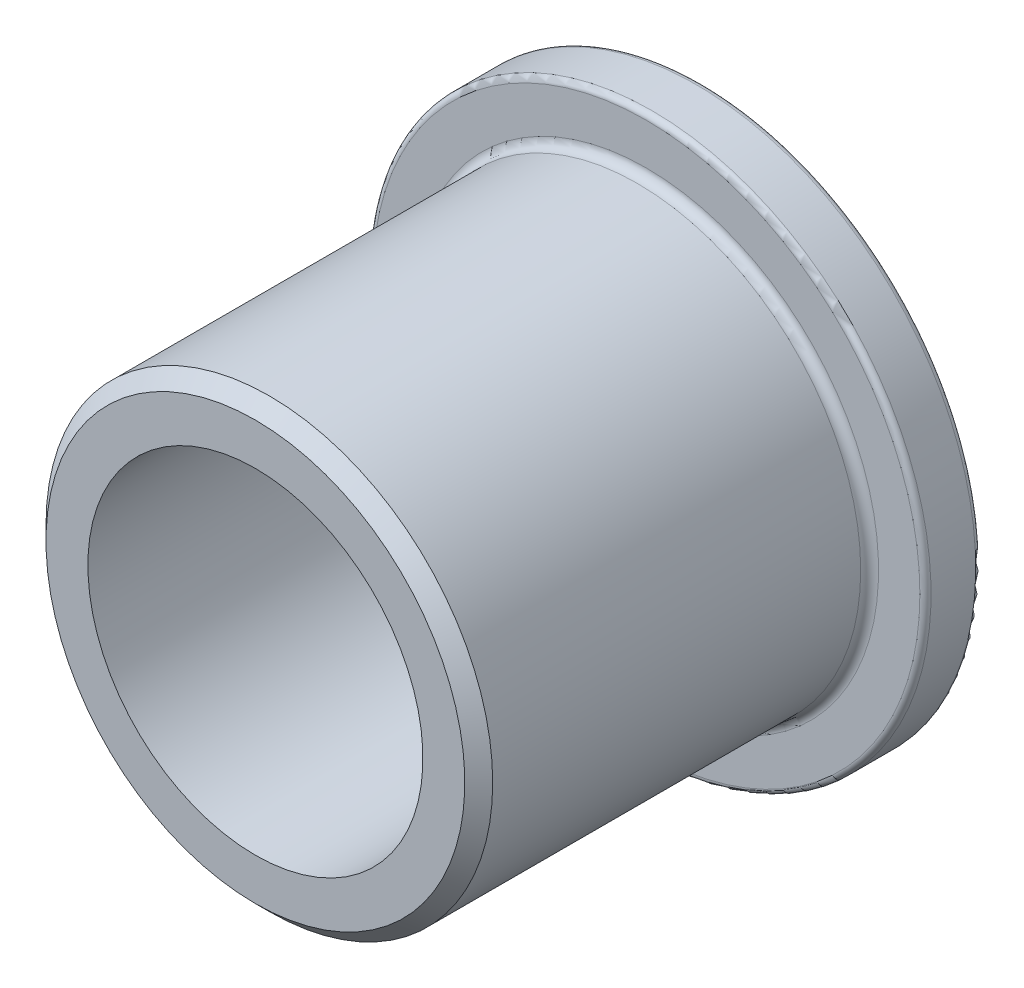
ISO-10303-21;
HEADER;
FILE_DESCRIPTION(('STEP AP214'),'2;1');
FILE_NAME('part.step','',(''),(''),'','','');
FILE_SCHEMA(('AUTOMOTIVE_DESIGN { 1 0 10303 214 1 1 1 1 }'));
ENDSEC;
DATA;
#1=APPLICATION_CONTEXT('core data for automotive mechanical design processes');
#2=APPLICATION_PROTOCOL_DEFINITION('international standard','automotive_design',2000,#1);
#3=PRODUCT_CONTEXT('',#1,'mechanical');
#4=PRODUCT('Part','Part','',(#3));
#5=PRODUCT_RELATED_PRODUCT_CATEGORY('part','',(#4));
#6=PRODUCT_DEFINITION_FORMATION('','',#4);
#7=PRODUCT_DEFINITION_CONTEXT('part definition',#1,'design');
#8=PRODUCT_DEFINITION('design','',#6,#7);
#9=PRODUCT_DEFINITION_SHAPE('','',#8);
#10=(LENGTH_UNIT() NAMED_UNIT(*) SI_UNIT(.MILLI.,.METRE.));
#11=(NAMED_UNIT(*) PLANE_ANGLE_UNIT() SI_UNIT($,.RADIAN.));
#12=(NAMED_UNIT(*) SI_UNIT($,.STERADIAN.) SOLID_ANGLE_UNIT());
#13=UNCERTAINTY_MEASURE_WITH_UNIT(LENGTH_MEASURE(1.E-05),#10,'distance_accuracy_value','');
#14=(GEOMETRIC_REPRESENTATION_CONTEXT(3) GLOBAL_UNCERTAINTY_ASSIGNED_CONTEXT((#13)) GLOBAL_UNIT_ASSIGNED_CONTEXT((#10,
#11,#12)) REPRESENTATION_CONTEXT('',''));
#15=CARTESIAN_POINT('',(0.,0.,0.));
#16=DIRECTION('',(0.,0.,1.));
#17=DIRECTION('',(1.,0.,0.));
#18=AXIS2_PLACEMENT_3D('',#15,#16,#17);
#19=CARTESIAN_POINT('',(0.,6.35,6.35));
#20=DIRECTION('',(0.,0.,-1.));
#21=DIRECTION('',(0.,1.,0.));
#22=AXIS2_PLACEMENT_3D('',#19,#20,#21);
#23=PLANE('',#22);
#24=CARTESIAN_POINT('',(0.,0.,6.35));
#25=DIRECTION('',(0.,0.,-1.));
#26=DIRECTION('',(0.,1.,0.));
#27=AXIS2_PLACEMENT_3D('',#24,#25,#26);
#28=CIRCLE('',#27,5.95312500000001);
#29=CARTESIAN_POINT('',(0.,5.95312500000001,6.35));
#30=VERTEX_POINT('',#29);
#31=EDGE_CURVE('E69',#30,#30,#28,.F.);
#32=ORIENTED_EDGE('',*,*,#31,.T.);
#33=EDGE_LOOP('',(#32));
#34=FACE_BOUND('',#33,.T.);
#35=CARTESIAN_POINT('',(0.,0.,6.35));
#36=DIRECTION('',(0.,0.,1.));
#37=DIRECTION('',(0.,-1.,0.));
#38=AXIS2_PLACEMENT_3D('',#35,#36,#37);
#39=CIRCLE('',#38,4.7625);
#40=CARTESIAN_POINT('',(0.,-4.7625,6.35));
#41=VERTEX_POINT('',#40);
#42=EDGE_CURVE('E72',#41,#41,#39,.T.);
#43=ORIENTED_EDGE('',*,*,#42,.F.);
#44=EDGE_LOOP('',(#43));
#45=FACE_BOUND('',#44,.T.);
#46=ADVANCED_FACE('F34',(#34,#45),#23,.F.);
#47=CARTESIAN_POINT('',(0.,0.,6.35));
#48=DIRECTION('',(0.,0.,1.));
#49=DIRECTION('',(0.,-1.,0.));
#50=AXIS2_PLACEMENT_3D('',#47,#48,#49);
#51=CYLINDRICAL_SURFACE('',#50,4.7625);
#52=CARTESIAN_POINT('',(0.,0.,-5.87375));
#53=DIRECTION('',(0.,0.,1.));
#54=DIRECTION('',(0.,-1.,0.));
#55=AXIS2_PLACEMENT_3D('',#52,#53,#54);
#56=CIRCLE('',#55,4.7625);
#57=CARTESIAN_POINT('',(0.,-4.7625,-5.87375));
#58=VERTEX_POINT('',#57);
#59=EDGE_CURVE('E10',#58,#58,#56,.F.);
#60=ORIENTED_EDGE('',*,*,#59,.T.);
#61=EDGE_LOOP('',(#60));
#62=FACE_BOUND('',#61,.T.);
#63=ORIENTED_EDGE('',*,*,#42,.T.);
#64=EDGE_LOOP('',(#63));
#65=FACE_BOUND('',#64,.T.);
#66=ADVANCED_FACE('F76',(#62,#65),#51,.F.);
#67=CARTESIAN_POINT('',(0.,4.7625,-6.35));
#68=DIRECTION('',(0.,0.,1.));
#69=DIRECTION('',(0.,-1.,0.));
#70=AXIS2_PLACEMENT_3D('',#67,#68,#69);
#71=PLANE('',#70);
#72=CARTESIAN_POINT('',(0.,0.,-6.35));
#73=DIRECTION('',(0.,0.,1.));
#74=DIRECTION('',(0.,-1.,0.));
#75=AXIS2_PLACEMENT_3D('',#72,#73,#74);
#76=CIRCLE('',#75,5.23875);
#77=CARTESIAN_POINT('',(0.,-5.23874999999999,-6.35));
#78=VERTEX_POINT('',#77);
#79=EDGE_CURVE('E41',#78,#78,#76,.T.);
#80=ORIENTED_EDGE('',*,*,#79,.T.);
#81=EDGE_LOOP('',(#80));
#82=FACE_BOUND('',#81,.T.);
#83=CARTESIAN_POINT('',(0.,0.,-6.35));
#84=DIRECTION('',(0.,0.,1.));
#85=DIRECTION('',(0.,-1.,0.));
#86=AXIS2_PLACEMENT_3D('',#83,#84,#85);
#87=CIRCLE('',#86,7.77875);
#88=CARTESIAN_POINT('',(0.,-7.77875,-6.35));
#89=VERTEX_POINT('',#88);
#90=EDGE_CURVE('E49',#89,#89,#87,.F.);
#91=ORIENTED_EDGE('',*,*,#90,.T.);
#92=EDGE_LOOP('',(#91));
#93=FACE_BOUND('',#92,.T.);
#94=ADVANCED_FACE('F84',(#82,#93),#71,.F.);
#95=CARTESIAN_POINT('',(0.,0.,6.35));
#96=DIRECTION('',(0.,0.,1.));
#97=DIRECTION('',(0.,-1.,0.));
#98=AXIS2_PLACEMENT_3D('',#95,#96,#97);
#99=CYLINDRICAL_SURFACE('',#98,7.9375);
#100=CARTESIAN_POINT('',(0.,0.,-6.19125));
#101=DIRECTION('',(0.,0.,1.));
#102=DIRECTION('',(0.,-1.,0.));
#103=AXIS2_PLACEMENT_3D('',#100,#101,#102);
#104=CIRCLE('',#103,7.9375);
#105=CARTESIAN_POINT('',(0.,-7.9375,-6.19125));
#106=VERTEX_POINT('',#105);
#107=EDGE_CURVE('E54',#106,#106,#104,.T.);
#108=ORIENTED_EDGE('',*,*,#107,.T.);
#109=EDGE_LOOP('',(#108));
#110=FACE_BOUND('',#109,.T.);
#111=CARTESIAN_POINT('',(0.,0.,-4.92125));
#112=DIRECTION('',(0.,0.,-1.));
#113=DIRECTION('',(0.,1.,0.));
#114=AXIS2_PLACEMENT_3D('',#111,#112,#113);
#115=CIRCLE('',#114,7.9375);
#116=CARTESIAN_POINT('',(0.,7.9375,-4.92125));
#117=VERTEX_POINT('',#116);
#118=EDGE_CURVE('E57',#117,#117,#115,.T.);
#119=ORIENTED_EDGE('',*,*,#118,.T.);
#120=EDGE_LOOP('',(#119));
#121=FACE_BOUND('',#120,.T.);
#122=ADVANCED_FACE('F114',(#110,#121),#99,.T.);
#123=CARTESIAN_POINT('',(0.,7.9375,-4.7625));
#124=DIRECTION('',(0.,0.,-1.));
#125=DIRECTION('',(0.,1.,0.));
#126=AXIS2_PLACEMENT_3D('',#123,#124,#125);
#127=PLANE('',#126);
#128=CARTESIAN_POINT('',(0.,0.,-4.7625));
#129=DIRECTION('',(0.,0.,-1.));
#130=DIRECTION('',(0.,1.,0.));
#131=AXIS2_PLACEMENT_3D('',#128,#129,#130);
#132=CIRCLE('',#131,7.77875);
#133=CARTESIAN_POINT('',(0.,7.77875,-4.7625));
#134=VERTEX_POINT('',#133);
#135=EDGE_CURVE('E45',#134,#134,#132,.F.);
#136=ORIENTED_EDGE('',*,*,#135,.T.);
#137=EDGE_LOOP('',(#136));
#138=FACE_BOUND('',#137,.T.);
#139=CARTESIAN_POINT('',(0.,0.,-4.7625));
#140=DIRECTION('',(0.,0.,-1.));
#141=DIRECTION('',(0.,1.,0.));
#142=AXIS2_PLACEMENT_3D('',#139,#140,#141);
#143=CIRCLE('',#142,6.604);
#144=CARTESIAN_POINT('',(0.,6.604,-4.7625));
#145=VERTEX_POINT('',#144);
#146=EDGE_CURVE('E60',#145,#145,#143,.T.);
#147=ORIENTED_EDGE('',*,*,#146,.T.);
#148=EDGE_LOOP('',(#147));
#149=FACE_BOUND('',#148,.T.);
#150=ADVANCED_FACE('F111',(#138,#149),#127,.F.);
#151=CARTESIAN_POINT('',(0.,0.,6.35));
#152=DIRECTION('',(0.,0.,1.));
#153=DIRECTION('',(0.,-1.,0.));
#154=AXIS2_PLACEMENT_3D('',#151,#152,#153);
#155=CYLINDRICAL_SURFACE('',#154,6.35);
#156=CARTESIAN_POINT('',(0.,0.,-4.5085));
#157=DIRECTION('',(0.,0.,-1.));
#158=DIRECTION('',(0.,1.,0.));
#159=AXIS2_PLACEMENT_3D('',#156,#157,#158);
#160=CIRCLE('',#159,6.35);
#161=CARTESIAN_POINT('',(0.,6.35,-4.5085));
#162=VERTEX_POINT('',#161);
#163=EDGE_CURVE('E63',#162,#162,#160,.F.);
#164=ORIENTED_EDGE('',*,*,#163,.T.);
#165=EDGE_LOOP('',(#164));
#166=FACE_BOUND('',#165,.T.);
#167=CARTESIAN_POINT('',(0.,0.,5.95312500000001));
#168=DIRECTION('',(0.,0.,-1.));
#169=DIRECTION('',(0.,1.,0.));
#170=AXIS2_PLACEMENT_3D('',#167,#168,#169);
#171=CIRCLE('',#170,6.35);
#172=CARTESIAN_POINT('',(0.,6.35,5.95312500000001));
#173=VERTEX_POINT('',#172);
#174=EDGE_CURVE('E66',#173,#173,#171,.T.);
#175=ORIENTED_EDGE('',*,*,#174,.T.);
#176=EDGE_LOOP('',(#175));
#177=FACE_BOUND('',#176,.T.);
#178=ADVANCED_FACE('F92',(#166,#177),#155,.T.);
#179=CARTESIAN_POINT('',(0.,0.,6.35));
#180=DIRECTION('',(0.,0.,-1.));
#181=DIRECTION('',(0.,1.,0.));
#182=AXIS2_PLACEMENT_3D('',#179,#180,#181);
#183=CONICAL_SURFACE('',#182,5.95312500000001,0.785398163397445);
#184=ORIENTED_EDGE('',*,*,#174,.F.);
#185=EDGE_LOOP('',(#184));
#186=FACE_BOUND('',#185,.T.);
#187=ORIENTED_EDGE('',*,*,#31,.F.);
#188=EDGE_LOOP('',(#187));
#189=FACE_BOUND('',#188,.T.);
#190=ADVANCED_FACE('F88',(#186,#189),#183,.T.);
#191=CARTESIAN_POINT('',(0.,0.,-4.5085));
#192=DIRECTION('',(0.,0.,-1.));
#193=DIRECTION('',(0.,1.,0.));
#194=AXIS2_PLACEMENT_3D('',#191,#192,#193);
#195=TOROIDAL_SURFACE('',#194,6.604,0.254);
#196=ORIENTED_EDGE('',*,*,#146,.F.);
#197=EDGE_LOOP('',(#196));
#198=FACE_BOUND('',#197,.T.);
#199=ORIENTED_EDGE('',*,*,#163,.F.);
#200=EDGE_LOOP('',(#199));
#201=FACE_BOUND('',#200,.T.);
#202=ADVANCED_FACE('F91',(#198,#201),#195,.F.);
#203=CARTESIAN_POINT('',(0.,0.,-6.19125));
#204=DIRECTION('',(0.,0.,1.));
#205=DIRECTION('',(0.,-1.,0.));
#206=AXIS2_PLACEMENT_3D('',#203,#204,#205);
#207=TOROIDAL_SURFACE('',#206,7.77875,0.15875);
#208=ORIENTED_EDGE('',*,*,#90,.F.);
#209=EDGE_LOOP('',(#208));
#210=FACE_BOUND('',#209,.T.);
#211=ORIENTED_EDGE('',*,*,#107,.F.);
#212=EDGE_LOOP('',(#211));
#213=FACE_BOUND('',#212,.T.);
#214=ADVANCED_FACE('F96',(#210,#213),#207,.T.);
#215=CARTESIAN_POINT('',(0.,0.,-4.92125));
#216=DIRECTION('',(0.,0.,-1.));
#217=DIRECTION('',(0.,1.,0.));
#218=AXIS2_PLACEMENT_3D('',#215,#216,#217);
#219=TOROIDAL_SURFACE('',#218,7.77875,0.15875);
#220=ORIENTED_EDGE('',*,*,#118,.F.);
#221=EDGE_LOOP('',(#220));
#222=FACE_BOUND('',#221,.T.);
#223=ORIENTED_EDGE('',*,*,#135,.F.);
#224=EDGE_LOOP('',(#223));
#225=FACE_BOUND('',#224,.T.);
#226=ADVANCED_FACE('F99',(#222,#225),#219,.T.);
#227=CARTESIAN_POINT('',(0.,0.,-6.35));
#228=DIRECTION('',(0.,0.,-1.));
#229=DIRECTION('',(0.,1.,0.));
#230=AXIS2_PLACEMENT_3D('',#227,#228,#229);
#231=CONICAL_SURFACE('',#230,5.23875,0.785398163397447);
#232=ORIENTED_EDGE('',*,*,#59,.F.);
#233=EDGE_LOOP('',(#232));
#234=FACE_BOUND('',#233,.T.);
#235=ORIENTED_EDGE('',*,*,#79,.F.);
#236=EDGE_LOOP('',(#235));
#237=FACE_BOUND('',#236,.T.);
#238=ADVANCED_FACE('F36',(#234,#237),#231,.F.);
#239=CLOSED_SHELL('',(#46,#66,#94,#122,#150,#178,#190,#202,#214,#226,#238));
#240=MANIFOLD_SOLID_BREP('B2',#239);
#241=ADVANCED_BREP_SHAPE_REPRESENTATION('',(#18,#240),#14);
#242=SHAPE_DEFINITION_REPRESENTATION(#9,#241);
ENDSEC;
END-ISO-10303-21;
